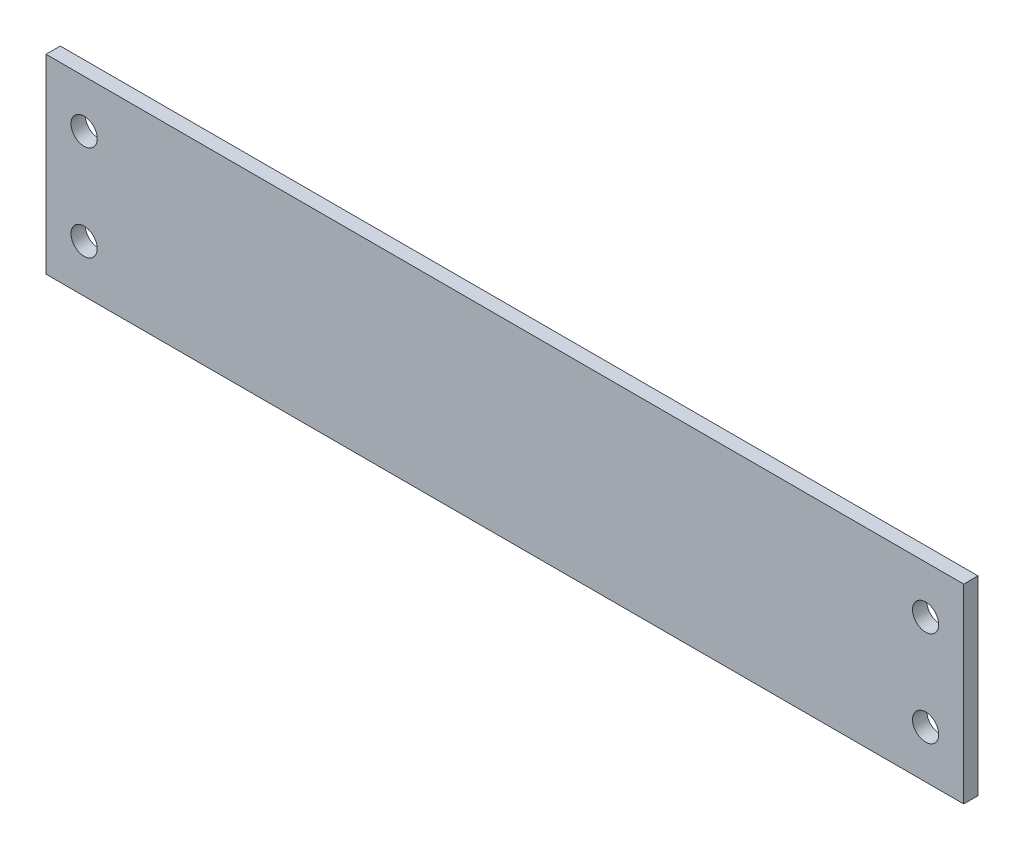
ISO-10303-21;
HEADER;
FILE_DESCRIPTION(('STEP AP214'),'2;1');
FILE_NAME('part.step','',(''),(''),'','','');
FILE_SCHEMA(('AUTOMOTIVE_DESIGN { 1 0 10303 214 1 1 1 1 }'));
ENDSEC;
DATA;
#1=APPLICATION_CONTEXT('core data for automotive mechanical design processes');
#2=APPLICATION_PROTOCOL_DEFINITION('international standard','automotive_design',2000,#1);
#3=PRODUCT_CONTEXT('',#1,'mechanical');
#4=PRODUCT('Part','Part','',(#3));
#5=PRODUCT_RELATED_PRODUCT_CATEGORY('part','',(#4));
#6=PRODUCT_DEFINITION_FORMATION('','',#4);
#7=PRODUCT_DEFINITION_CONTEXT('part definition',#1,'design');
#8=PRODUCT_DEFINITION('design','',#6,#7);
#9=PRODUCT_DEFINITION_SHAPE('','',#8);
#10=(LENGTH_UNIT() NAMED_UNIT(*) SI_UNIT(.MILLI.,.METRE.));
#11=(NAMED_UNIT(*) PLANE_ANGLE_UNIT() SI_UNIT($,.RADIAN.));
#12=(NAMED_UNIT(*) SI_UNIT($,.STERADIAN.) SOLID_ANGLE_UNIT());
#13=UNCERTAINTY_MEASURE_WITH_UNIT(LENGTH_MEASURE(1.E-05),#10,'distance_accuracy_value','');
#14=(GEOMETRIC_REPRESENTATION_CONTEXT(3) GLOBAL_UNCERTAINTY_ASSIGNED_CONTEXT((#13)) GLOBAL_UNIT_ASSIGNED_CONTEXT((#10,
#11,#12)) REPRESENTATION_CONTEXT('',''));
#15=CARTESIAN_POINT('',(0.,0.,0.));
#16=DIRECTION('',(0.,0.,1.));
#17=DIRECTION('',(1.,0.,0.));
#18=AXIS2_PLACEMENT_3D('',#15,#16,#17);
#19=CARTESIAN_POINT('',(-192.75,40.,3.));
#20=DIRECTION('',(0.,-1.,0.));
#21=DIRECTION('',(1.,0.,0.));
#22=AXIS2_PLACEMENT_3D('',#19,#20,#21);
#23=PLANE('',#22);
#24=DIRECTION('',(-1.,0.,0.));
#25=VECTOR('',#24,1.);
#26=CARTESIAN_POINT('',(-192.75,40.,0.));
#27=LINE('',#26,#25);
#28=CARTESIAN_POINT('',(0.,40.,0.));
#29=VERTEX_POINT('',#28);
#30=CARTESIAN_POINT('',(-192.75,40.,0.));
#31=VERTEX_POINT('',#30);
#32=EDGE_CURVE('E98',#29,#31,#27,.T.);
#33=ORIENTED_EDGE('',*,*,#32,.T.);
#34=DIRECTION('',(0.,0.,-1.));
#35=VECTOR('',#34,1.);
#36=CARTESIAN_POINT('',(-192.75,40.,3.));
#37=LINE('',#36,#35);
#38=CARTESIAN_POINT('',(-192.75,40.,3.));
#39=VERTEX_POINT('',#38);
#40=EDGE_CURVE('E11',#39,#31,#37,.T.);
#41=ORIENTED_EDGE('',*,*,#40,.F.);
#42=DIRECTION('',(-1.,0.,0.));
#43=VECTOR('',#42,1.);
#44=CARTESIAN_POINT('',(-192.75,40.,3.));
#45=LINE('',#44,#43);
#46=CARTESIAN_POINT('',(0.,40.,3.));
#47=VERTEX_POINT('',#46);
#48=EDGE_CURVE('E86',#47,#39,#45,.T.);
#49=ORIENTED_EDGE('',*,*,#48,.F.);
#50=DIRECTION('',(0.,0.,-1.));
#51=VECTOR('',#50,1.);
#52=CARTESIAN_POINT('',(0.,40.,3.));
#53=LINE('',#52,#51);
#54=EDGE_CURVE('E94',#47,#29,#53,.T.);
#55=ORIENTED_EDGE('',*,*,#54,.T.);
#56=EDGE_LOOP('',(#33,#41,#49,#55));
#57=FACE_BOUND('',#56,.T.);
#58=ADVANCED_FACE('F35',(#57),#23,.F.);
#59=CARTESIAN_POINT('',(-192.75,40.,3.));
#60=DIRECTION('',(1.,0.,0.));
#61=DIRECTION('',(0.,0.,-1.));
#62=AXIS2_PLACEMENT_3D('',#59,#60,#61);
#63=PLANE('',#62);
#64=DIRECTION('',(0.,-1.,0.));
#65=VECTOR('',#64,1.);
#66=CARTESIAN_POINT('',(-192.75,40.,0.));
#67=LINE('',#66,#65);
#68=CARTESIAN_POINT('',(-192.75,0.,0.));
#69=VERTEX_POINT('',#68);
#70=EDGE_CURVE('E90',#31,#69,#67,.T.);
#71=ORIENTED_EDGE('',*,*,#70,.T.);
#72=DIRECTION('',(0.,0.,-1.));
#73=VECTOR('',#72,1.);
#74=CARTESIAN_POINT('',(-192.75,0.,3.));
#75=LINE('',#74,#73);
#76=CARTESIAN_POINT('',(-192.75,0.,3.));
#77=VERTEX_POINT('',#76);
#78=EDGE_CURVE('E43',#77,#69,#75,.T.);
#79=ORIENTED_EDGE('',*,*,#78,.F.);
#80=DIRECTION('',(0.,-1.,0.));
#81=VECTOR('',#80,1.);
#82=CARTESIAN_POINT('',(-192.75,40.,3.));
#83=LINE('',#82,#81);
#84=EDGE_CURVE('E81',#39,#77,#83,.T.);
#85=ORIENTED_EDGE('',*,*,#84,.F.);
#86=ORIENTED_EDGE('',*,*,#40,.T.);
#87=EDGE_LOOP('',(#71,#79,#85,#86));
#88=FACE_BOUND('',#87,.T.);
#89=ADVANCED_FACE('F89',(#88),#63,.F.);
#90=CARTESIAN_POINT('',(-192.75,0.,3.));
#91=DIRECTION('',(0.,1.,0.));
#92=DIRECTION('',(0.,0.,1.));
#93=AXIS2_PLACEMENT_3D('',#90,#91,#92);
#94=PLANE('',#93);
#95=DIRECTION('',(1.,0.,0.));
#96=VECTOR('',#95,1.);
#97=CARTESIAN_POINT('',(-192.75,0.,0.));
#98=LINE('',#97,#96);
#99=CARTESIAN_POINT('',(0.,0.,0.));
#100=VERTEX_POINT('',#99);
#101=EDGE_CURVE('E68',#69,#100,#98,.T.);
#102=ORIENTED_EDGE('',*,*,#101,.T.);
#103=DIRECTION('',(0.,0.,-1.));
#104=VECTOR('',#103,1.);
#105=CARTESIAN_POINT('',(0.,0.,3.));
#106=LINE('',#105,#104);
#107=CARTESIAN_POINT('',(0.,0.,3.));
#108=VERTEX_POINT('',#107);
#109=EDGE_CURVE('E91',#108,#100,#106,.T.);
#110=ORIENTED_EDGE('',*,*,#109,.F.);
#111=DIRECTION('',(1.,0.,0.));
#112=VECTOR('',#111,1.);
#113=CARTESIAN_POINT('',(-192.75,0.,3.));
#114=LINE('',#113,#112);
#115=EDGE_CURVE('E84',#77,#108,#114,.T.);
#116=ORIENTED_EDGE('',*,*,#115,.F.);
#117=ORIENTED_EDGE('',*,*,#78,.T.);
#118=EDGE_LOOP('',(#102,#110,#116,#117));
#119=FACE_BOUND('',#118,.T.);
#120=ADVANCED_FACE('F92',(#119),#94,.F.);
#121=CARTESIAN_POINT('',(0.,40.,3.));
#122=DIRECTION('',(-1.,0.,0.));
#123=DIRECTION('',(0.,0.,1.));
#124=AXIS2_PLACEMENT_3D('',#121,#122,#123);
#125=PLANE('',#124);
#126=DIRECTION('',(0.,1.,0.));
#127=VECTOR('',#126,1.);
#128=CARTESIAN_POINT('',(0.,40.,0.));
#129=LINE('',#128,#127);
#130=EDGE_CURVE('E74',#100,#29,#129,.T.);
#131=ORIENTED_EDGE('',*,*,#130,.T.);
#132=ORIENTED_EDGE('',*,*,#54,.F.);
#133=DIRECTION('',(0.,1.,0.));
#134=VECTOR('',#133,1.);
#135=CARTESIAN_POINT('',(0.,40.,3.));
#136=LINE('',#135,#134);
#137=EDGE_CURVE('E51',#108,#47,#136,.T.);
#138=ORIENTED_EDGE('',*,*,#137,.F.);
#139=ORIENTED_EDGE('',*,*,#109,.T.);
#140=EDGE_LOOP('',(#131,#132,#138,#139));
#141=FACE_BOUND('',#140,.T.);
#142=ADVANCED_FACE('F106',(#141),#125,.F.);
#143=CARTESIAN_POINT('',(0.,0.,3.));
#144=DIRECTION('',(0.,0.,-1.));
#145=DIRECTION('',(-1.,0.,0.));
#146=AXIS2_PLACEMENT_3D('',#143,#144,#145);
#147=PLANE('',#146);
#148=CARTESIAN_POINT('',(-8.00000000000002,30.,3.));
#149=DIRECTION('',(0.,0.,1.));
#150=DIRECTION('',(1.,0.,0.));
#151=AXIS2_PLACEMENT_3D('',#148,#149,#150);
#152=CIRCLE('',#151,2.75);
#153=CARTESIAN_POINT('',(-5.25000000000002,30.,3.));
#154=VERTEX_POINT('',#153);
#155=EDGE_CURVE('E132',#154,#154,#152,.T.);
#156=ORIENTED_EDGE('',*,*,#155,.F.);
#157=EDGE_LOOP('',(#156));
#158=FACE_BOUND('',#157,.T.);
#159=CARTESIAN_POINT('',(-8.00000000000002,10.,3.));
#160=DIRECTION('',(0.,0.,1.));
#161=DIRECTION('',(1.,0.,0.));
#162=AXIS2_PLACEMENT_3D('',#159,#160,#161);
#163=CIRCLE('',#162,2.75);
#164=CARTESIAN_POINT('',(-5.25000000000002,10.,3.));
#165=VERTEX_POINT('',#164);
#166=EDGE_CURVE('E126',#165,#165,#163,.T.);
#167=ORIENTED_EDGE('',*,*,#166,.F.);
#168=EDGE_LOOP('',(#167));
#169=FACE_BOUND('',#168,.T.);
#170=CARTESIAN_POINT('',(-184.75,30.,3.));
#171=DIRECTION('',(0.,0.,1.));
#172=DIRECTION('',(1.,0.,0.));
#173=AXIS2_PLACEMENT_3D('',#170,#171,#172);
#174=CIRCLE('',#173,2.75);
#175=CARTESIAN_POINT('',(-182.,30.,3.));
#176=VERTEX_POINT('',#175);
#177=EDGE_CURVE('E120',#176,#176,#174,.T.);
#178=ORIENTED_EDGE('',*,*,#177,.F.);
#179=EDGE_LOOP('',(#178));
#180=FACE_BOUND('',#179,.T.);
#181=CARTESIAN_POINT('',(-184.75,10.,3.));
#182=DIRECTION('',(0.,0.,1.));
#183=DIRECTION('',(1.,0.,0.));
#184=AXIS2_PLACEMENT_3D('',#181,#182,#183);
#185=CIRCLE('',#184,2.75);
#186=CARTESIAN_POINT('',(-182.,10.,3.));
#187=VERTEX_POINT('',#186);
#188=EDGE_CURVE('E114',#187,#187,#185,.T.);
#189=ORIENTED_EDGE('',*,*,#188,.F.);
#190=EDGE_LOOP('',(#189));
#191=FACE_BOUND('',#190,.T.);
#192=ORIENTED_EDGE('',*,*,#48,.T.);
#193=ORIENTED_EDGE('',*,*,#84,.T.);
#194=ORIENTED_EDGE('',*,*,#115,.T.);
#195=ORIENTED_EDGE('',*,*,#137,.T.);
#196=EDGE_LOOP('',(#192,#193,#194,#195));
#197=FACE_BOUND('',#196,.T.);
#198=ADVANCED_FACE('F82',(#158,#169,#180,#191,#197),#147,.F.);
#199=CARTESIAN_POINT('',(0.,0.,0.));
#200=DIRECTION('',(0.,0.,-1.));
#201=DIRECTION('',(-1.,0.,0.));
#202=AXIS2_PLACEMENT_3D('',#199,#200,#201);
#203=PLANE('',#202);
#204=CARTESIAN_POINT('',(-8.00000000000002,30.,0.));
#205=DIRECTION('',(0.,0.,1.));
#206=DIRECTION('',(1.,0.,0.));
#207=AXIS2_PLACEMENT_3D('',#204,#205,#206);
#208=CIRCLE('',#207,2.75);
#209=CARTESIAN_POINT('',(-5.25000000000002,30.,0.));
#210=VERTEX_POINT('',#209);
#211=EDGE_CURVE('E129',#210,#210,#208,.T.);
#212=ORIENTED_EDGE('',*,*,#211,.T.);
#213=EDGE_LOOP('',(#212));
#214=FACE_BOUND('',#213,.T.);
#215=CARTESIAN_POINT('',(-8.00000000000002,10.,0.));
#216=DIRECTION('',(0.,0.,1.));
#217=DIRECTION('',(1.,0.,0.));
#218=AXIS2_PLACEMENT_3D('',#215,#216,#217);
#219=CIRCLE('',#218,2.75);
#220=CARTESIAN_POINT('',(-5.25000000000002,10.,0.));
#221=VERTEX_POINT('',#220);
#222=EDGE_CURVE('E123',#221,#221,#219,.T.);
#223=ORIENTED_EDGE('',*,*,#222,.T.);
#224=EDGE_LOOP('',(#223));
#225=FACE_BOUND('',#224,.T.);
#226=CARTESIAN_POINT('',(-184.75,30.,0.));
#227=DIRECTION('',(0.,0.,1.));
#228=DIRECTION('',(1.,0.,0.));
#229=AXIS2_PLACEMENT_3D('',#226,#227,#228);
#230=CIRCLE('',#229,2.75);
#231=CARTESIAN_POINT('',(-182.,30.,0.));
#232=VERTEX_POINT('',#231);
#233=EDGE_CURVE('E117',#232,#232,#230,.T.);
#234=ORIENTED_EDGE('',*,*,#233,.T.);
#235=EDGE_LOOP('',(#234));
#236=FACE_BOUND('',#235,.T.);
#237=CARTESIAN_POINT('',(-184.75,10.,0.));
#238=DIRECTION('',(0.,0.,1.));
#239=DIRECTION('',(1.,0.,0.));
#240=AXIS2_PLACEMENT_3D('',#237,#238,#239);
#241=CIRCLE('',#240,2.75);
#242=CARTESIAN_POINT('',(-182.,10.,0.));
#243=VERTEX_POINT('',#242);
#244=EDGE_CURVE('E101',#243,#243,#241,.T.);
#245=ORIENTED_EDGE('',*,*,#244,.T.);
#246=EDGE_LOOP('',(#245));
#247=FACE_BOUND('',#246,.T.);
#248=ORIENTED_EDGE('',*,*,#32,.F.);
#249=ORIENTED_EDGE('',*,*,#130,.F.);
#250=ORIENTED_EDGE('',*,*,#101,.F.);
#251=ORIENTED_EDGE('',*,*,#70,.F.);
#252=EDGE_LOOP('',(#248,#249,#250,#251));
#253=FACE_BOUND('',#252,.T.);
#254=ADVANCED_FACE('F109',(#214,#225,#236,#247,#253),#203,.T.);
#255=CARTESIAN_POINT('',(-184.75,10.,3.));
#256=DIRECTION('',(0.,0.,1.));
#257=DIRECTION('',(1.,0.,0.));
#258=AXIS2_PLACEMENT_3D('',#255,#256,#257);
#259=CYLINDRICAL_SURFACE('',#258,2.75);
#260=ORIENTED_EDGE('',*,*,#244,.F.);
#261=EDGE_LOOP('',(#260));
#262=FACE_BOUND('',#261,.T.);
#263=ORIENTED_EDGE('',*,*,#188,.T.);
#264=EDGE_LOOP('',(#263));
#265=FACE_BOUND('',#264,.T.);
#266=ADVANCED_FACE('F147',(#262,#265),#259,.F.);
#267=CARTESIAN_POINT('',(-184.75,30.,3.));
#268=DIRECTION('',(0.,0.,1.));
#269=DIRECTION('',(1.,0.,0.));
#270=AXIS2_PLACEMENT_3D('',#267,#268,#269);
#271=CYLINDRICAL_SURFACE('',#270,2.75);
#272=ORIENTED_EDGE('',*,*,#233,.F.);
#273=EDGE_LOOP('',(#272));
#274=FACE_BOUND('',#273,.T.);
#275=ORIENTED_EDGE('',*,*,#177,.T.);
#276=EDGE_LOOP('',(#275));
#277=FACE_BOUND('',#276,.T.);
#278=ADVANCED_FACE('F149',(#274,#277),#271,.F.);
#279=CARTESIAN_POINT('',(-8.00000000000002,10.,3.));
#280=DIRECTION('',(0.,0.,1.));
#281=DIRECTION('',(1.,0.,0.));
#282=AXIS2_PLACEMENT_3D('',#279,#280,#281);
#283=CYLINDRICAL_SURFACE('',#282,2.75);
#284=ORIENTED_EDGE('',*,*,#222,.F.);
#285=EDGE_LOOP('',(#284));
#286=FACE_BOUND('',#285,.T.);
#287=ORIENTED_EDGE('',*,*,#166,.T.);
#288=EDGE_LOOP('',(#287));
#289=FACE_BOUND('',#288,.T.);
#290=ADVANCED_FACE('F156',(#286,#289),#283,.F.);
#291=CARTESIAN_POINT('',(-8.00000000000002,30.,3.));
#292=DIRECTION('',(0.,0.,1.));
#293=DIRECTION('',(1.,0.,0.));
#294=AXIS2_PLACEMENT_3D('',#291,#292,#293);
#295=CYLINDRICAL_SURFACE('',#294,2.75);
#296=ORIENTED_EDGE('',*,*,#211,.F.);
#297=EDGE_LOOP('',(#296));
#298=FACE_BOUND('',#297,.T.);
#299=ORIENTED_EDGE('',*,*,#155,.T.);
#300=EDGE_LOOP('',(#299));
#301=FACE_BOUND('',#300,.T.);
#302=ADVANCED_FACE('F136',(#298,#301),#295,.F.);
#303=CLOSED_SHELL('',(#58,#89,#120,#142,#198,#254,#266,#278,#290,#302));
#304=MANIFOLD_SOLID_BREP('B2',#303);
#305=ADVANCED_BREP_SHAPE_REPRESENTATION('',(#18,#304),#14);
#306=SHAPE_DEFINITION_REPRESENTATION(#9,#305);
ENDSEC;
END-ISO-10303-21;
